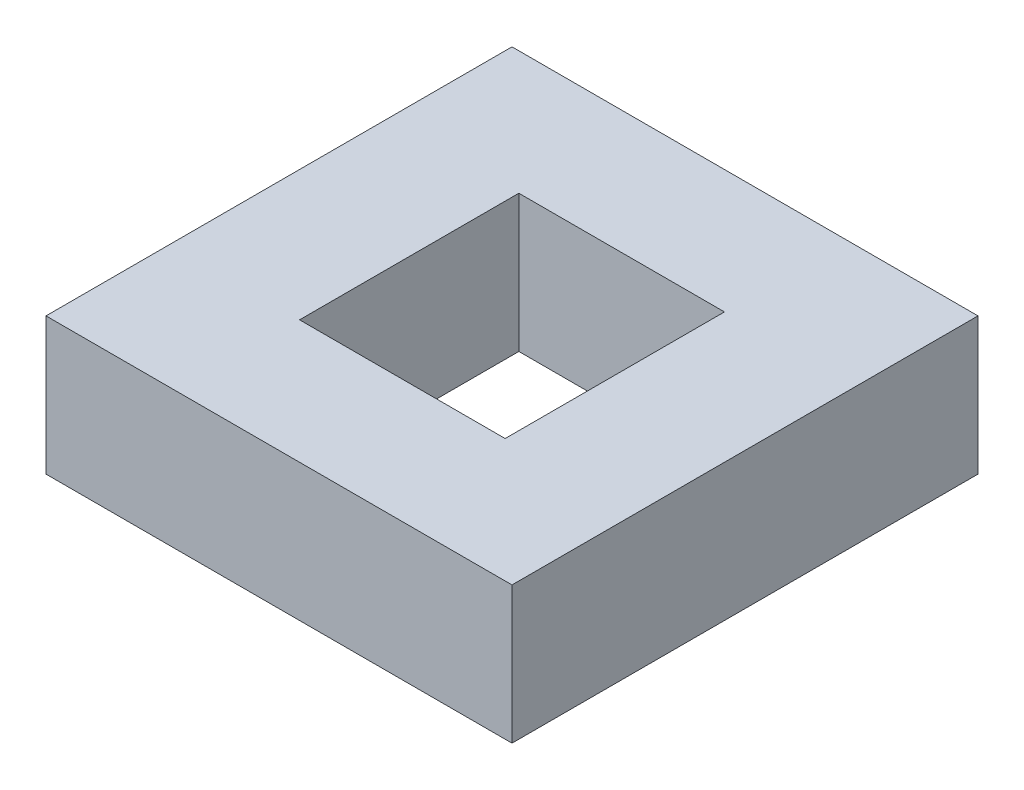
ISO-10303-21;
HEADER;
FILE_DESCRIPTION(('STEP AP214'),'2;1');
FILE_NAME('part.step','',(''),(''),'','','');
FILE_SCHEMA(('AUTOMOTIVE_DESIGN { 1 0 10303 214 1 1 1 1 }'));
ENDSEC;
DATA;
#1=APPLICATION_CONTEXT('core data for automotive mechanical design processes');
#2=APPLICATION_PROTOCOL_DEFINITION('international standard','automotive_design',2000,#1);
#3=PRODUCT_CONTEXT('',#1,'mechanical');
#4=PRODUCT('Part','Part','',(#3));
#5=PRODUCT_RELATED_PRODUCT_CATEGORY('part','',(#4));
#6=PRODUCT_DEFINITION_FORMATION('','',#4);
#7=PRODUCT_DEFINITION_CONTEXT('part definition',#1,'design');
#8=PRODUCT_DEFINITION('design','',#6,#7);
#9=PRODUCT_DEFINITION_SHAPE('','',#8);
#10=(LENGTH_UNIT() NAMED_UNIT(*) SI_UNIT(.MILLI.,.METRE.));
#11=(NAMED_UNIT(*) PLANE_ANGLE_UNIT() SI_UNIT($,.RADIAN.));
#12=(NAMED_UNIT(*) SI_UNIT($,.STERADIAN.) SOLID_ANGLE_UNIT());
#13=UNCERTAINTY_MEASURE_WITH_UNIT(LENGTH_MEASURE(1.E-05),#10,'distance_accuracy_value','');
#14=(GEOMETRIC_REPRESENTATION_CONTEXT(3) GLOBAL_UNCERTAINTY_ASSIGNED_CONTEXT((#13)) GLOBAL_UNIT_ASSIGNED_CONTEXT((#10,
#11,#12)) REPRESENTATION_CONTEXT('',''));
#15=CARTESIAN_POINT('',(0.,0.,0.));
#16=DIRECTION('',(0.,0.,1.));
#17=DIRECTION('',(1.,0.,0.));
#18=AXIS2_PLACEMENT_3D('',#15,#16,#17);
#19=CARTESIAN_POINT('',(85.,50.,85.));
#20=DIRECTION('',(-1.,0.,0.));
#21=DIRECTION('',(0.,0.,1.));
#22=AXIS2_PLACEMENT_3D('',#19,#20,#21);
#23=PLANE('',#22);
#24=DIRECTION('',(0.,0.,-1.));
#25=VECTOR('',#24,1.);
#26=CARTESIAN_POINT('',(85.,0.,85.));
#27=LINE('',#26,#25);
#28=CARTESIAN_POINT('',(85.,0.,85.));
#29=VERTEX_POINT('',#28);
#30=CARTESIAN_POINT('',(85.,0.,-85.));
#31=VERTEX_POINT('',#30);
#32=EDGE_CURVE('E130',#29,#31,#27,.T.);
#33=ORIENTED_EDGE('',*,*,#32,.T.);
#34=DIRECTION('',(0.,-1.,0.));
#35=VECTOR('',#34,1.);
#36=CARTESIAN_POINT('',(85.,50.,-85.));
#37=LINE('',#36,#35);
#38=CARTESIAN_POINT('',(85.,50.,-85.));
#39=VERTEX_POINT('',#38);
#40=EDGE_CURVE('E11',#39,#31,#37,.T.);
#41=ORIENTED_EDGE('',*,*,#40,.F.);
#42=DIRECTION('',(0.,0.,-1.));
#43=VECTOR('',#42,1.);
#44=CARTESIAN_POINT('',(85.,50.,85.));
#45=LINE('',#44,#43);
#46=CARTESIAN_POINT('',(85.,50.,85.));
#47=VERTEX_POINT('',#46);
#48=EDGE_CURVE('E134',#47,#39,#45,.T.);
#49=ORIENTED_EDGE('',*,*,#48,.F.);
#50=DIRECTION('',(0.,-1.,0.));
#51=VECTOR('',#50,1.);
#52=CARTESIAN_POINT('',(85.,50.,85.));
#53=LINE('',#52,#51);
#54=EDGE_CURVE('E144',#47,#29,#53,.T.);
#55=ORIENTED_EDGE('',*,*,#54,.T.);
#56=EDGE_LOOP('',(#33,#41,#49,#55));
#57=FACE_BOUND('',#56,.T.);
#58=ADVANCED_FACE('F33',(#57),#23,.F.);
#59=CARTESIAN_POINT('',(-85.,50.,-85.));
#60=DIRECTION('',(0.,0.,1.));
#61=DIRECTION('',(1.,0.,0.));
#62=AXIS2_PLACEMENT_3D('',#59,#60,#61);
#63=PLANE('',#62);
#64=DIRECTION('',(-1.,0.,0.));
#65=VECTOR('',#64,1.);
#66=CARTESIAN_POINT('',(-85.,0.,-85.));
#67=LINE('',#66,#65);
#68=CARTESIAN_POINT('',(-85.,0.,-85.));
#69=VERTEX_POINT('',#68);
#70=EDGE_CURVE('E147',#31,#69,#67,.T.);
#71=ORIENTED_EDGE('',*,*,#70,.T.);
#72=DIRECTION('',(0.,-1.,0.));
#73=VECTOR('',#72,1.);
#74=CARTESIAN_POINT('',(-85.,50.,-85.));
#75=LINE('',#74,#73);
#76=CARTESIAN_POINT('',(-85.,50.,-85.));
#77=VERTEX_POINT('',#76);
#78=EDGE_CURVE('E40',#77,#69,#75,.T.);
#79=ORIENTED_EDGE('',*,*,#78,.F.);
#80=DIRECTION('',(-1.,0.,0.));
#81=VECTOR('',#80,1.);
#82=CARTESIAN_POINT('',(-85.,50.,-85.));
#83=LINE('',#82,#81);
#84=EDGE_CURVE('E137',#39,#77,#83,.T.);
#85=ORIENTED_EDGE('',*,*,#84,.F.);
#86=ORIENTED_EDGE('',*,*,#40,.T.);
#87=EDGE_LOOP('',(#71,#79,#85,#86));
#88=FACE_BOUND('',#87,.T.);
#89=ADVANCED_FACE('F175',(#88),#63,.F.);
#90=CARTESIAN_POINT('',(-85.,50.,85.));
#91=DIRECTION('',(1.,0.,0.));
#92=DIRECTION('',(0.,0.,-1.));
#93=AXIS2_PLACEMENT_3D('',#90,#91,#92);
#94=PLANE('',#93);
#95=DIRECTION('',(0.,0.,1.));
#96=VECTOR('',#95,1.);
#97=CARTESIAN_POINT('',(-85.,0.,85.));
#98=LINE('',#97,#96);
#99=CARTESIAN_POINT('',(-85.,0.,85.));
#100=VERTEX_POINT('',#99);
#101=EDGE_CURVE('E149',#69,#100,#98,.T.);
#102=ORIENTED_EDGE('',*,*,#101,.T.);
#103=DIRECTION('',(0.,-1.,0.));
#104=VECTOR('',#103,1.);
#105=CARTESIAN_POINT('',(-85.,50.,85.));
#106=LINE('',#105,#104);
#107=CARTESIAN_POINT('',(-85.,50.,85.));
#108=VERTEX_POINT('',#107);
#109=EDGE_CURVE('E154',#108,#100,#106,.T.);
#110=ORIENTED_EDGE('',*,*,#109,.F.);
#111=DIRECTION('',(0.,0.,1.));
#112=VECTOR('',#111,1.);
#113=CARTESIAN_POINT('',(-85.,50.,85.));
#114=LINE('',#113,#112);
#115=EDGE_CURVE('E140',#77,#108,#114,.T.);
#116=ORIENTED_EDGE('',*,*,#115,.F.);
#117=ORIENTED_EDGE('',*,*,#78,.T.);
#118=EDGE_LOOP('',(#102,#110,#116,#117));
#119=FACE_BOUND('',#118,.T.);
#120=ADVANCED_FACE('F161',(#119),#94,.F.);
#121=CARTESIAN_POINT('',(-85.,50.,85.));
#122=DIRECTION('',(0.,0.,-1.));
#123=DIRECTION('',(-1.,0.,0.));
#124=AXIS2_PLACEMENT_3D('',#121,#122,#123);
#125=PLANE('',#124);
#126=DIRECTION('',(1.,0.,0.));
#127=VECTOR('',#126,1.);
#128=CARTESIAN_POINT('',(-85.,0.,85.));
#129=LINE('',#128,#127);
#130=EDGE_CURVE('E138',#100,#29,#129,.T.);
#131=ORIENTED_EDGE('',*,*,#130,.T.);
#132=ORIENTED_EDGE('',*,*,#54,.F.);
#133=DIRECTION('',(1.,0.,0.));
#134=VECTOR('',#133,1.);
#135=CARTESIAN_POINT('',(-85.,50.,85.));
#136=LINE('',#135,#134);
#137=EDGE_CURVE('E142',#108,#47,#136,.T.);
#138=ORIENTED_EDGE('',*,*,#137,.F.);
#139=ORIENTED_EDGE('',*,*,#109,.T.);
#140=EDGE_LOOP('',(#131,#132,#138,#139));
#141=FACE_BOUND('',#140,.T.);
#142=ADVANCED_FACE('F168',(#141),#125,.F.);
#143=CARTESIAN_POINT('',(0.,50.,0.));
#144=DIRECTION('',(0.,-1.,0.));
#145=DIRECTION('',(0.,0.,-1.));
#146=AXIS2_PLACEMENT_3D('',#143,#144,#145);
#147=PLANE('',#146);
#148=DIRECTION('',(-1.,0.,0.));
#149=VECTOR('',#148,1.);
#150=CARTESIAN_POINT('',(-37.5,50.,-40.));
#151=LINE('',#150,#149);
#152=CARTESIAN_POINT('',(37.5,50.,-40.));
#153=VERTEX_POINT('',#152);
#154=CARTESIAN_POINT('',(-37.5,50.,-40.));
#155=VERTEX_POINT('',#154);
#156=EDGE_CURVE('E124',#153,#155,#151,.T.);
#157=ORIENTED_EDGE('',*,*,#156,.F.);
#158=DIRECTION('',(0.,0.,-1.));
#159=VECTOR('',#158,1.);
#160=CARTESIAN_POINT('',(37.5,50.,40.));
#161=LINE('',#160,#159);
#162=CARTESIAN_POINT('',(37.5,50.,40.));
#163=VERTEX_POINT('',#162);
#164=EDGE_CURVE('E47',#163,#153,#161,.T.);
#165=ORIENTED_EDGE('',*,*,#164,.F.);
#166=DIRECTION('',(1.,0.,0.));
#167=VECTOR('',#166,1.);
#168=CARTESIAN_POINT('',(-37.5,50.,40.));
#169=LINE('',#168,#167);
#170=CARTESIAN_POINT('',(-37.5,50.,40.));
#171=VERTEX_POINT('',#170);
#172=EDGE_CURVE('E115',#171,#163,#169,.T.);
#173=ORIENTED_EDGE('',*,*,#172,.F.);
#174=DIRECTION('',(0.,0.,1.));
#175=VECTOR('',#174,1.);
#176=CARTESIAN_POINT('',(-37.5,50.,40.));
#177=LINE('',#176,#175);
#178=EDGE_CURVE('E118',#155,#171,#177,.T.);
#179=ORIENTED_EDGE('',*,*,#178,.F.);
#180=EDGE_LOOP('',(#157,#165,#173,#179));
#181=FACE_BOUND('',#180,.T.);
#182=ORIENTED_EDGE('',*,*,#48,.T.);
#183=ORIENTED_EDGE('',*,*,#84,.T.);
#184=ORIENTED_EDGE('',*,*,#115,.T.);
#185=ORIENTED_EDGE('',*,*,#137,.T.);
#186=EDGE_LOOP('',(#182,#183,#184,#185));
#187=FACE_BOUND('',#186,.T.);
#188=ADVANCED_FACE('F174',(#181,#187),#147,.F.);
#189=CARTESIAN_POINT('',(0.,0.,0.));
#190=DIRECTION('',(0.,-1.,0.));
#191=DIRECTION('',(0.,0.,-1.));
#192=AXIS2_PLACEMENT_3D('',#189,#190,#191);
#193=PLANE('',#192);
#194=DIRECTION('',(0.,0.,-1.));
#195=VECTOR('',#194,1.);
#196=CARTESIAN_POINT('',(37.5,0.,40.));
#197=LINE('',#196,#195);
#198=CARTESIAN_POINT('',(37.5,0.,40.));
#199=VERTEX_POINT('',#198);
#200=CARTESIAN_POINT('',(37.5,0.,-40.));
#201=VERTEX_POINT('',#200);
#202=EDGE_CURVE('E99',#199,#201,#197,.T.);
#203=ORIENTED_EDGE('',*,*,#202,.T.);
#204=DIRECTION('',(-1.,0.,0.));
#205=VECTOR('',#204,1.);
#206=CARTESIAN_POINT('',(-37.5,0.,-40.));
#207=LINE('',#206,#205);
#208=CARTESIAN_POINT('',(-37.5,0.,-40.));
#209=VERTEX_POINT('',#208);
#210=EDGE_CURVE('E108',#201,#209,#207,.T.);
#211=ORIENTED_EDGE('',*,*,#210,.T.);
#212=DIRECTION('',(0.,0.,1.));
#213=VECTOR('',#212,1.);
#214=CARTESIAN_POINT('',(-37.5,0.,40.));
#215=LINE('',#214,#213);
#216=CARTESIAN_POINT('',(-37.5,0.,40.));
#217=VERTEX_POINT('',#216);
#218=EDGE_CURVE('E55',#209,#217,#215,.T.);
#219=ORIENTED_EDGE('',*,*,#218,.T.);
#220=DIRECTION('',(1.,0.,0.));
#221=VECTOR('',#220,1.);
#222=CARTESIAN_POINT('',(-37.5,0.,40.));
#223=LINE('',#222,#221);
#224=EDGE_CURVE('E105',#217,#199,#223,.T.);
#225=ORIENTED_EDGE('',*,*,#224,.T.);
#226=EDGE_LOOP('',(#203,#211,#219,#225));
#227=FACE_BOUND('',#226,.T.);
#228=ORIENTED_EDGE('',*,*,#32,.F.);
#229=ORIENTED_EDGE('',*,*,#130,.F.);
#230=ORIENTED_EDGE('',*,*,#101,.F.);
#231=ORIENTED_EDGE('',*,*,#70,.F.);
#232=EDGE_LOOP('',(#228,#229,#230,#231));
#233=FACE_BOUND('',#232,.T.);
#234=ADVANCED_FACE('F112',(#227,#233),#193,.T.);
#235=CARTESIAN_POINT('',(37.5,0.,40.));
#236=DIRECTION('',(1.,0.,0.));
#237=DIRECTION('',(0.,0.,-1.));
#238=AXIS2_PLACEMENT_3D('',#235,#236,#237);
#239=PLANE('',#238);
#240=ORIENTED_EDGE('',*,*,#164,.T.);
#241=DIRECTION('',(0.,1.,0.));
#242=VECTOR('',#241,1.);
#243=CARTESIAN_POINT('',(37.5,0.,-40.));
#244=LINE('',#243,#242);
#245=EDGE_CURVE('E95',#201,#153,#244,.T.);
#246=ORIENTED_EDGE('',*,*,#245,.F.);
#247=ORIENTED_EDGE('',*,*,#202,.F.);
#248=DIRECTION('',(0.,1.,0.));
#249=VECTOR('',#248,1.);
#250=CARTESIAN_POINT('',(37.5,0.,40.));
#251=LINE('',#250,#249);
#252=EDGE_CURVE('E128',#199,#163,#251,.T.);
#253=ORIENTED_EDGE('',*,*,#252,.T.);
#254=EDGE_LOOP('',(#240,#246,#247,#253));
#255=FACE_BOUND('',#254,.T.);
#256=ADVANCED_FACE('F97',(#255),#239,.F.);
#257=CARTESIAN_POINT('',(-37.5,0.,40.));
#258=DIRECTION('',(0.,0.,1.));
#259=DIRECTION('',(1.,0.,0.));
#260=AXIS2_PLACEMENT_3D('',#257,#258,#259);
#261=PLANE('',#260);
#262=ORIENTED_EDGE('',*,*,#172,.T.);
#263=ORIENTED_EDGE('',*,*,#252,.F.);
#264=ORIENTED_EDGE('',*,*,#224,.F.);
#265=DIRECTION('',(0.,1.,0.));
#266=VECTOR('',#265,1.);
#267=CARTESIAN_POINT('',(-37.5,0.,40.));
#268=LINE('',#267,#266);
#269=EDGE_CURVE('E131',#217,#171,#268,.T.);
#270=ORIENTED_EDGE('',*,*,#269,.T.);
#271=EDGE_LOOP('',(#262,#263,#264,#270));
#272=FACE_BOUND('',#271,.T.);
#273=ADVANCED_FACE('F192',(#272),#261,.F.);
#274=CARTESIAN_POINT('',(-37.5,0.,40.));
#275=DIRECTION('',(-1.,0.,0.));
#276=DIRECTION('',(0.,0.,1.));
#277=AXIS2_PLACEMENT_3D('',#274,#275,#276);
#278=PLANE('',#277);
#279=ORIENTED_EDGE('',*,*,#178,.T.);
#280=ORIENTED_EDGE('',*,*,#269,.F.);
#281=ORIENTED_EDGE('',*,*,#218,.F.);
#282=DIRECTION('',(0.,1.,0.));
#283=VECTOR('',#282,1.);
#284=CARTESIAN_POINT('',(-37.5,0.,-40.));
#285=LINE('',#284,#283);
#286=EDGE_CURVE('E104',#209,#155,#285,.T.);
#287=ORIENTED_EDGE('',*,*,#286,.T.);
#288=EDGE_LOOP('',(#279,#280,#281,#287));
#289=FACE_BOUND('',#288,.T.);
#290=ADVANCED_FACE('F195',(#289),#278,.F.);
#291=CARTESIAN_POINT('',(-37.5,0.,-40.));
#292=DIRECTION('',(0.,0.,-1.));
#293=DIRECTION('',(-1.,0.,0.));
#294=AXIS2_PLACEMENT_3D('',#291,#292,#293);
#295=PLANE('',#294);
#296=ORIENTED_EDGE('',*,*,#156,.T.);
#297=ORIENTED_EDGE('',*,*,#286,.F.);
#298=ORIENTED_EDGE('',*,*,#210,.F.);
#299=ORIENTED_EDGE('',*,*,#245,.T.);
#300=EDGE_LOOP('',(#296,#297,#298,#299));
#301=FACE_BOUND('',#300,.T.);
#302=ADVANCED_FACE('F109',(#301),#295,.F.);
#303=CLOSED_SHELL('',(#58,#89,#120,#142,#188,#234,#256,#273,#290,#302));
#304=MANIFOLD_SOLID_BREP('B2',#303);
#305=ADVANCED_BREP_SHAPE_REPRESENTATION('',(#18,#304),#14);
#306=SHAPE_DEFINITION_REPRESENTATION(#9,#305);
ENDSEC;
END-ISO-10303-21;
